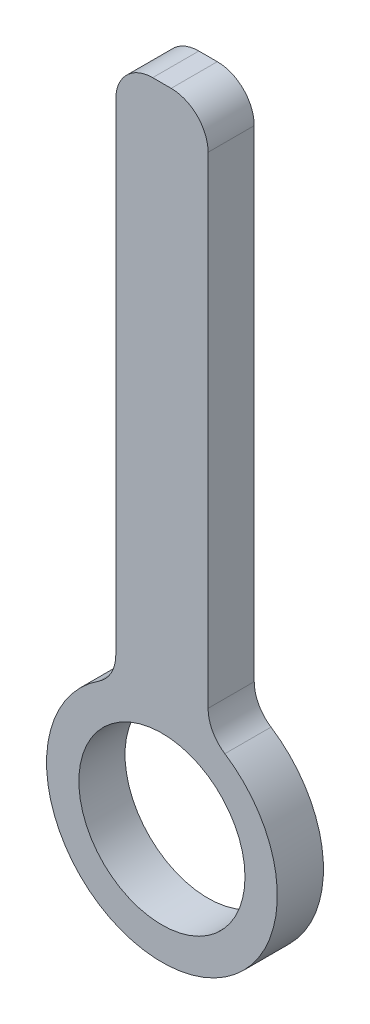
ISO-10303-21;
HEADER;
FILE_DESCRIPTION(('STEP AP214'),'2;1');
FILE_NAME('part.step','',(''),(''),'','','');
FILE_SCHEMA(('AUTOMOTIVE_DESIGN { 1 0 10303 214 1 1 1 1 }'));
ENDSEC;
DATA;
#1=APPLICATION_CONTEXT('core data for automotive mechanical design processes');
#2=APPLICATION_PROTOCOL_DEFINITION('international standard','automotive_design',2000,#1);
#3=PRODUCT_CONTEXT('',#1,'mechanical');
#4=PRODUCT('Part','Part','',(#3));
#5=PRODUCT_RELATED_PRODUCT_CATEGORY('part','',(#4));
#6=PRODUCT_DEFINITION_FORMATION('','',#4);
#7=PRODUCT_DEFINITION_CONTEXT('part definition',#1,'design');
#8=PRODUCT_DEFINITION('design','',#6,#7);
#9=PRODUCT_DEFINITION_SHAPE('','',#8);
#10=(LENGTH_UNIT() NAMED_UNIT(*) SI_UNIT(.MILLI.,.METRE.));
#11=(NAMED_UNIT(*) PLANE_ANGLE_UNIT() SI_UNIT($,.RADIAN.));
#12=(NAMED_UNIT(*) SI_UNIT($,.STERADIAN.) SOLID_ANGLE_UNIT());
#13=UNCERTAINTY_MEASURE_WITH_UNIT(LENGTH_MEASURE(1.E-05),#10,'distance_accuracy_value','');
#14=(GEOMETRIC_REPRESENTATION_CONTEXT(3) GLOBAL_UNCERTAINTY_ASSIGNED_CONTEXT((#13)) GLOBAL_UNIT_ASSIGNED_CONTEXT((#10,
#11,#12)) REPRESENTATION_CONTEXT('',''));
#15=CARTESIAN_POINT('',(0.,0.,0.));
#16=DIRECTION('',(0.,0.,1.));
#17=DIRECTION('',(1.,0.,0.));
#18=AXIS2_PLACEMENT_3D('',#15,#16,#17);
#19=CARTESIAN_POINT('',(9.,13.8293166859393,2.5));
#20=DIRECTION('',(0.,0.,1.));
#21=DIRECTION('',(1.,0.,0.));
#22=AXIS2_PLACEMENT_3D('',#19,#20,#21);
#23=PLANE('',#22);
#24=CARTESIAN_POINT('',(9.,13.8293166859393,2.5));
#25=DIRECTION('',(0.,0.,-1.));
#26=DIRECTION('',(1.,0.,0.));
#27=AXIS2_PLACEMENT_3D('',#24,#25,#26);
#28=CIRCLE('',#27,4.);
#29=CARTESIAN_POINT('',(6.81818181818182,10.4767550651056,2.5));
#30=VERTEX_POINT('',#29);
#31=CARTESIAN_POINT('',(5.,13.8293166859393,2.5));
#32=VERTEX_POINT('',#31);
#33=EDGE_CURVE('E146',#30,#32,#28,.T.);
#34=ORIENTED_EDGE('',*,*,#33,.T.);
#35=DIRECTION('',(0.,1.,0.));
#36=VECTOR('',#35,1.);
#37=CARTESIAN_POINT('',(5.,13.8293166859393,2.5));
#38=LINE('',#37,#36);
#39=CARTESIAN_POINT('',(5.,66.,2.5));
#40=VERTEX_POINT('',#39);
#41=EDGE_CURVE('E94',#32,#40,#38,.T.);
#42=ORIENTED_EDGE('',*,*,#41,.T.);
#43=CARTESIAN_POINT('',(1.,66.,2.5));
#44=DIRECTION('',(0.,0.,1.));
#45=DIRECTION('',(1.,0.,0.));
#46=AXIS2_PLACEMENT_3D('',#43,#44,#45);
#47=CIRCLE('',#46,4.);
#48=CARTESIAN_POINT('',(0.999999999999973,70.,2.5));
#49=VERTEX_POINT('',#48);
#50=EDGE_CURVE('E161',#40,#49,#47,.T.);
#51=ORIENTED_EDGE('',*,*,#50,.T.);
#52=DIRECTION('',(-1.,0.,0.));
#53=VECTOR('',#52,1.);
#54=CARTESIAN_POINT('',(-0.999999999999971,70.,2.5));
#55=LINE('',#54,#53);
#56=CARTESIAN_POINT('',(-0.999999999999971,70.,2.5));
#57=VERTEX_POINT('',#56);
#58=EDGE_CURVE('E174',#49,#57,#55,.T.);
#59=ORIENTED_EDGE('',*,*,#58,.T.);
#60=CARTESIAN_POINT('',(-1.,66.,2.5));
#61=DIRECTION('',(0.,0.,1.));
#62=DIRECTION('',(-1.,0.,0.));
#63=AXIS2_PLACEMENT_3D('',#60,#61,#62);
#64=CIRCLE('',#63,4.);
#65=CARTESIAN_POINT('',(-5.,66.,2.5));
#66=VERTEX_POINT('',#65);
#67=EDGE_CURVE('E113',#57,#66,#64,.T.);
#68=ORIENTED_EDGE('',*,*,#67,.T.);
#69=DIRECTION('',(0.,-1.,0.));
#70=VECTOR('',#69,1.);
#71=CARTESIAN_POINT('',(-5.,13.8293166859393,2.5));
#72=LINE('',#71,#70);
#73=CARTESIAN_POINT('',(-5.,13.8293166859393,2.5));
#74=VERTEX_POINT('',#73);
#75=EDGE_CURVE('E107',#66,#74,#72,.T.);
#76=ORIENTED_EDGE('',*,*,#75,.T.);
#77=CARTESIAN_POINT('',(-9.,13.8293166859393,2.5));
#78=DIRECTION('',(0.,0.,-1.));
#79=DIRECTION('',(-1.,0.,0.));
#80=AXIS2_PLACEMENT_3D('',#77,#78,#79);
#81=CIRCLE('',#80,4.);
#82=CARTESIAN_POINT('',(-6.81818181818182,10.4767550651056,2.5));
#83=VERTEX_POINT('',#82);
#84=EDGE_CURVE('E111',#74,#83,#81,.T.);
#85=ORIENTED_EDGE('',*,*,#84,.T.);
#86=CARTESIAN_POINT('',(0.,0.,2.5));
#87=DIRECTION('',(0.,0.,1.));
#88=DIRECTION('',(1.,0.,0.));
#89=AXIS2_PLACEMENT_3D('',#86,#87,#88);
#90=CIRCLE('',#89,12.5);
#91=EDGE_CURVE('E51',#83,#30,#90,.T.);
#92=ORIENTED_EDGE('',*,*,#91,.T.);
#93=EDGE_LOOP('',(#34,#42,#51,#59,#68,#76,#85,#92));
#94=FACE_BOUND('',#93,.T.);
#95=CARTESIAN_POINT('',(0.,0.,2.5));
#96=DIRECTION('',(0.,0.,1.));
#97=DIRECTION('',(1.,0.,0.));
#98=AXIS2_PLACEMENT_3D('',#95,#96,#97);
#99=CIRCLE('',#98,9.);
#100=CARTESIAN_POINT('',(9.,0.,2.5));
#101=VERTEX_POINT('',#100);
#102=EDGE_CURVE('E135',#101,#101,#99,.T.);
#103=ORIENTED_EDGE('',*,*,#102,.F.);
#104=EDGE_LOOP('',(#103));
#105=FACE_BOUND('',#104,.T.);
#106=ADVANCED_FACE('F34',(#94,#105),#23,.T.);
#107=CARTESIAN_POINT('',(9.,13.8293166859393,-2.5));
#108=DIRECTION('',(0.,0.,1.));
#109=DIRECTION('',(1.,0.,0.));
#110=AXIS2_PLACEMENT_3D('',#107,#108,#109);
#111=PLANE('',#110);
#112=CARTESIAN_POINT('',(9.,13.8293166859393,-2.5));
#113=DIRECTION('',(0.,0.,-1.));
#114=DIRECTION('',(1.,0.,0.));
#115=AXIS2_PLACEMENT_3D('',#112,#113,#114);
#116=CIRCLE('',#115,4.);
#117=CARTESIAN_POINT('',(6.81818181818182,10.4767550651056,-2.5));
#118=VERTEX_POINT('',#117);
#119=CARTESIAN_POINT('',(5.,13.8293166859393,-2.5));
#120=VERTEX_POINT('',#119);
#121=EDGE_CURVE('E131',#118,#120,#116,.T.);
#122=ORIENTED_EDGE('',*,*,#121,.F.);
#123=CARTESIAN_POINT('',(0.,0.,-2.5));
#124=DIRECTION('',(0.,0.,1.));
#125=DIRECTION('',(1.,0.,0.));
#126=AXIS2_PLACEMENT_3D('',#123,#124,#125);
#127=CIRCLE('',#126,12.5);
#128=CARTESIAN_POINT('',(-6.81818181818182,10.4767550651056,-2.5));
#129=VERTEX_POINT('',#128);
#130=EDGE_CURVE('E86',#129,#118,#127,.T.);
#131=ORIENTED_EDGE('',*,*,#130,.F.);
#132=CARTESIAN_POINT('',(-9.,13.8293166859393,-2.5));
#133=DIRECTION('',(0.,0.,-1.));
#134=DIRECTION('',(-1.,0.,0.));
#135=AXIS2_PLACEMENT_3D('',#132,#133,#134);
#136=CIRCLE('',#135,4.);
#137=CARTESIAN_POINT('',(-5.,13.8293166859393,-2.5));
#138=VERTEX_POINT('',#137);
#139=EDGE_CURVE('E80',#138,#129,#136,.T.);
#140=ORIENTED_EDGE('',*,*,#139,.F.);
#141=DIRECTION('',(0.,-1.,0.));
#142=VECTOR('',#141,1.);
#143=CARTESIAN_POINT('',(-5.,13.8293166859393,-2.5));
#144=LINE('',#143,#142);
#145=CARTESIAN_POINT('',(-5.,66.,-2.5));
#146=VERTEX_POINT('',#145);
#147=EDGE_CURVE('E121',#146,#138,#144,.T.);
#148=ORIENTED_EDGE('',*,*,#147,.F.);
#149=CARTESIAN_POINT('',(-1.,66.,-2.5));
#150=DIRECTION('',(0.,0.,1.));
#151=DIRECTION('',(-1.,0.,0.));
#152=AXIS2_PLACEMENT_3D('',#149,#150,#151);
#153=CIRCLE('',#152,4.);
#154=CARTESIAN_POINT('',(-0.999999999999971,70.,-2.5));
#155=VERTEX_POINT('',#154);
#156=EDGE_CURVE('E141',#155,#146,#153,.T.);
#157=ORIENTED_EDGE('',*,*,#156,.F.);
#158=DIRECTION('',(-1.,0.,0.));
#159=VECTOR('',#158,1.);
#160=CARTESIAN_POINT('',(-0.999999999999971,70.,-2.5));
#161=LINE('',#160,#159);
#162=CARTESIAN_POINT('',(0.999999999999973,70.,-2.5));
#163=VERTEX_POINT('',#162);
#164=EDGE_CURVE('E139',#163,#155,#161,.T.);
#165=ORIENTED_EDGE('',*,*,#164,.F.);
#166=CARTESIAN_POINT('',(1.,66.,-2.5));
#167=DIRECTION('',(0.,0.,1.));
#168=DIRECTION('',(1.,0.,0.));
#169=AXIS2_PLACEMENT_3D('',#166,#167,#168);
#170=CIRCLE('',#169,4.);
#171=CARTESIAN_POINT('',(5.,66.,-2.5));
#172=VERTEX_POINT('',#171);
#173=EDGE_CURVE('E137',#172,#163,#170,.T.);
#174=ORIENTED_EDGE('',*,*,#173,.F.);
#175=DIRECTION('',(0.,1.,0.));
#176=VECTOR('',#175,1.);
#177=CARTESIAN_POINT('',(5.,13.8293166859393,-2.5));
#178=LINE('',#177,#176);
#179=EDGE_CURVE('E134',#120,#172,#178,.T.);
#180=ORIENTED_EDGE('',*,*,#179,.F.);
#181=EDGE_LOOP('',(#122,#131,#140,#148,#157,#165,#174,#180));
#182=FACE_BOUND('',#181,.T.);
#183=CARTESIAN_POINT('',(0.,0.,-2.5));
#184=DIRECTION('',(0.,0.,1.));
#185=DIRECTION('',(1.,0.,0.));
#186=AXIS2_PLACEMENT_3D('',#183,#184,#185);
#187=CIRCLE('',#186,9.);
#188=CARTESIAN_POINT('',(9.,0.,-2.5));
#189=VERTEX_POINT('',#188);
#190=EDGE_CURVE('E180',#189,#189,#187,.T.);
#191=ORIENTED_EDGE('',*,*,#190,.T.);
#192=EDGE_LOOP('',(#191));
#193=FACE_BOUND('',#192,.T.);
#194=ADVANCED_FACE('F165',(#182,#193),#111,.F.);
#195=CARTESIAN_POINT('',(9.,13.8293166859393,2.5));
#196=DIRECTION('',(0.,0.,-1.));
#197=DIRECTION('',(-1.,0.,0.));
#198=AXIS2_PLACEMENT_3D('',#195,#196,#197);
#199=CYLINDRICAL_SURFACE('',#198,4.);
#200=ORIENTED_EDGE('',*,*,#121,.T.);
#201=DIRECTION('',(0.,0.,-1.));
#202=VECTOR('',#201,1.);
#203=CARTESIAN_POINT('',(5.,13.8293166859393,2.5));
#204=LINE('',#203,#202);
#205=EDGE_CURVE('E11',#32,#120,#204,.T.);
#206=ORIENTED_EDGE('',*,*,#205,.F.);
#207=ORIENTED_EDGE('',*,*,#33,.F.);
#208=DIRECTION('',(0.,0.,-1.));
#209=VECTOR('',#208,1.);
#210=CARTESIAN_POINT('',(6.81818181818182,10.4767550651056,2.5));
#211=LINE('',#210,#209);
#212=EDGE_CURVE('E127',#30,#118,#211,.T.);
#213=ORIENTED_EDGE('',*,*,#212,.T.);
#214=EDGE_LOOP('',(#200,#206,#207,#213));
#215=FACE_BOUND('',#214,.T.);
#216=ADVANCED_FACE('F36',(#215),#199,.F.);
#217=CARTESIAN_POINT('',(5.,13.8293166859393,2.5));
#218=DIRECTION('',(-1.,0.,0.));
#219=DIRECTION('',(0.,0.,1.));
#220=AXIS2_PLACEMENT_3D('',#217,#218,#219);
#221=PLANE('',#220);
#222=ORIENTED_EDGE('',*,*,#179,.T.);
#223=DIRECTION('',(0.,0.,-1.));
#224=VECTOR('',#223,1.);
#225=CARTESIAN_POINT('',(5.,66.,2.5));
#226=LINE('',#225,#224);
#227=EDGE_CURVE('E43',#40,#172,#226,.T.);
#228=ORIENTED_EDGE('',*,*,#227,.F.);
#229=ORIENTED_EDGE('',*,*,#41,.F.);
#230=ORIENTED_EDGE('',*,*,#205,.T.);
#231=EDGE_LOOP('',(#222,#228,#229,#230));
#232=FACE_BOUND('',#231,.T.);
#233=ADVANCED_FACE('F208',(#232),#221,.F.);
#234=CARTESIAN_POINT('',(1.,66.,2.5));
#235=DIRECTION('',(0.,0.,-1.));
#236=DIRECTION('',(-1.,0.,0.));
#237=AXIS2_PLACEMENT_3D('',#234,#235,#236);
#238=CYLINDRICAL_SURFACE('',#237,4.);
#239=ORIENTED_EDGE('',*,*,#173,.T.);
#240=DIRECTION('',(0.,0.,-1.));
#241=VECTOR('',#240,1.);
#242=CARTESIAN_POINT('',(0.999999999999973,70.,2.5));
#243=LINE('',#242,#241);
#244=EDGE_CURVE('E153',#49,#163,#243,.T.);
#245=ORIENTED_EDGE('',*,*,#244,.F.);
#246=ORIENTED_EDGE('',*,*,#50,.F.);
#247=ORIENTED_EDGE('',*,*,#227,.T.);
#248=EDGE_LOOP('',(#239,#245,#246,#247));
#249=FACE_BOUND('',#248,.T.);
#250=ADVANCED_FACE('F159',(#249),#238,.T.);
#251=CARTESIAN_POINT('',(-0.999999999999971,70.,2.5));
#252=DIRECTION('',(0.,-1.,0.));
#253=DIRECTION('',(0.,0.,-1.));
#254=AXIS2_PLACEMENT_3D('',#251,#252,#253);
#255=PLANE('',#254);
#256=ORIENTED_EDGE('',*,*,#164,.T.);
#257=DIRECTION('',(0.,0.,-1.));
#258=VECTOR('',#257,1.);
#259=CARTESIAN_POINT('',(-0.999999999999971,70.,2.5));
#260=LINE('',#259,#258);
#261=EDGE_CURVE('E150',#57,#155,#260,.T.);
#262=ORIENTED_EDGE('',*,*,#261,.F.);
#263=ORIENTED_EDGE('',*,*,#58,.F.);
#264=ORIENTED_EDGE('',*,*,#244,.T.);
#265=EDGE_LOOP('',(#256,#262,#263,#264));
#266=FACE_BOUND('',#265,.T.);
#267=ADVANCED_FACE('F170',(#266),#255,.F.);
#268=CARTESIAN_POINT('',(-1.,66.,2.5));
#269=DIRECTION('',(0.,0.,-1.));
#270=DIRECTION('',(-1.,0.,0.));
#271=AXIS2_PLACEMENT_3D('',#268,#269,#270);
#272=CYLINDRICAL_SURFACE('',#271,4.);
#273=ORIENTED_EDGE('',*,*,#156,.T.);
#274=DIRECTION('',(0.,0.,-1.));
#275=VECTOR('',#274,1.);
#276=CARTESIAN_POINT('',(-5.,66.,2.5));
#277=LINE('',#276,#275);
#278=EDGE_CURVE('E122',#66,#146,#277,.T.);
#279=ORIENTED_EDGE('',*,*,#278,.F.);
#280=ORIENTED_EDGE('',*,*,#67,.F.);
#281=ORIENTED_EDGE('',*,*,#261,.T.);
#282=EDGE_LOOP('',(#273,#279,#280,#281));
#283=FACE_BOUND('',#282,.T.);
#284=ADVANCED_FACE('F173',(#283),#272,.T.);
#285=CARTESIAN_POINT('',(-5.,13.8293166859393,2.5));
#286=DIRECTION('',(1.,0.,0.));
#287=DIRECTION('',(0.,0.,-1.));
#288=AXIS2_PLACEMENT_3D('',#285,#286,#287);
#289=PLANE('',#288);
#290=ORIENTED_EDGE('',*,*,#147,.T.);
#291=DIRECTION('',(0.,0.,-1.));
#292=VECTOR('',#291,1.);
#293=CARTESIAN_POINT('',(-5.,13.8293166859393,2.5));
#294=LINE('',#293,#292);
#295=EDGE_CURVE('E118',#74,#138,#294,.T.);
#296=ORIENTED_EDGE('',*,*,#295,.F.);
#297=ORIENTED_EDGE('',*,*,#75,.F.);
#298=ORIENTED_EDGE('',*,*,#278,.T.);
#299=EDGE_LOOP('',(#290,#296,#297,#298));
#300=FACE_BOUND('',#299,.T.);
#301=ADVANCED_FACE('F119',(#300),#289,.F.);
#302=CARTESIAN_POINT('',(-9.,13.8293166859393,2.5));
#303=DIRECTION('',(0.,0.,-1.));
#304=DIRECTION('',(-1.,0.,0.));
#305=AXIS2_PLACEMENT_3D('',#302,#303,#304);
#306=CYLINDRICAL_SURFACE('',#305,4.);
#307=ORIENTED_EDGE('',*,*,#139,.T.);
#308=DIRECTION('',(0.,0.,-1.));
#309=VECTOR('',#308,1.);
#310=CARTESIAN_POINT('',(-6.81818181818182,10.4767550651056,2.5));
#311=LINE('',#310,#309);
#312=EDGE_CURVE('E123',#83,#129,#311,.T.);
#313=ORIENTED_EDGE('',*,*,#312,.F.);
#314=ORIENTED_EDGE('',*,*,#84,.F.);
#315=ORIENTED_EDGE('',*,*,#295,.T.);
#316=EDGE_LOOP('',(#307,#313,#314,#315));
#317=FACE_BOUND('',#316,.T.);
#318=ADVANCED_FACE('F125',(#317),#306,.F.);
#319=CARTESIAN_POINT('',(0.,0.,2.5));
#320=DIRECTION('',(0.,0.,-1.));
#321=DIRECTION('',(-1.,0.,0.));
#322=AXIS2_PLACEMENT_3D('',#319,#320,#321);
#323=CYLINDRICAL_SURFACE('',#322,12.5);
#324=ORIENTED_EDGE('',*,*,#130,.T.);
#325=ORIENTED_EDGE('',*,*,#212,.F.);
#326=ORIENTED_EDGE('',*,*,#91,.F.);
#327=ORIENTED_EDGE('',*,*,#312,.T.);
#328=EDGE_LOOP('',(#324,#325,#326,#327));
#329=FACE_BOUND('',#328,.T.);
#330=ADVANCED_FACE('F196',(#329),#323,.T.);
#331=CARTESIAN_POINT('',(0.,0.,2.5));
#332=DIRECTION('',(0.,0.,-1.));
#333=DIRECTION('',(-1.,0.,0.));
#334=AXIS2_PLACEMENT_3D('',#331,#332,#333);
#335=CYLINDRICAL_SURFACE('',#334,9.);
#336=ORIENTED_EDGE('',*,*,#102,.T.);
#337=EDGE_LOOP('',(#336));
#338=FACE_BOUND('',#337,.T.);
#339=ORIENTED_EDGE('',*,*,#190,.F.);
#340=EDGE_LOOP('',(#339));
#341=FACE_BOUND('',#340,.T.);
#342=ADVANCED_FACE('F186',(#338,#341),#335,.F.);
#343=CLOSED_SHELL('',(#106,#194,#216,#233,#250,#267,#284,#301,#318,#330,#342));
#344=MANIFOLD_SOLID_BREP('B2',#343);
#345=ADVANCED_BREP_SHAPE_REPRESENTATION('',(#18,#344),#14);
#346=SHAPE_DEFINITION_REPRESENTATION(#9,#345);
ENDSEC;
END-ISO-10303-21;
